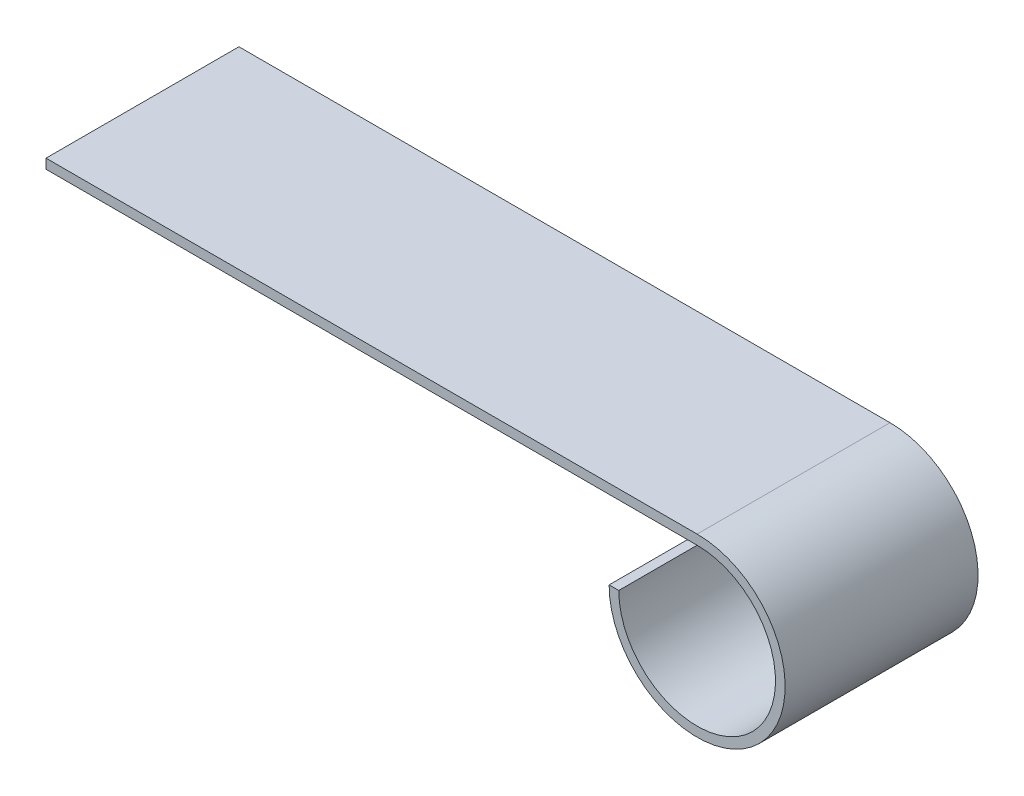
ISO-10303-21;
HEADER;
FILE_DESCRIPTION(('STEP AP214'),'2;1');
FILE_NAME('part.step','',(''),(''),'','','');
FILE_SCHEMA(('AUTOMOTIVE_DESIGN { 1 0 10303 214 1 1 1 1 }'));
ENDSEC;
DATA;
#1=APPLICATION_CONTEXT('core data for automotive mechanical design processes');
#2=APPLICATION_PROTOCOL_DEFINITION('international standard','automotive_design',2000,#1);
#3=PRODUCT_CONTEXT('',#1,'mechanical');
#4=PRODUCT('Part','Part','',(#3));
#5=PRODUCT_RELATED_PRODUCT_CATEGORY('part','',(#4));
#6=PRODUCT_DEFINITION_FORMATION('','',#4);
#7=PRODUCT_DEFINITION_CONTEXT('part definition',#1,'design');
#8=PRODUCT_DEFINITION('design','',#6,#7);
#9=PRODUCT_DEFINITION_SHAPE('','',#8);
#10=(LENGTH_UNIT() NAMED_UNIT(*) SI_UNIT(.MILLI.,.METRE.));
#11=(NAMED_UNIT(*) PLANE_ANGLE_UNIT() SI_UNIT($,.RADIAN.));
#12=(NAMED_UNIT(*) SI_UNIT($,.STERADIAN.) SOLID_ANGLE_UNIT());
#13=UNCERTAINTY_MEASURE_WITH_UNIT(LENGTH_MEASURE(1.E-05),#10,'distance_accuracy_value','');
#14=(GEOMETRIC_REPRESENTATION_CONTEXT(3) GLOBAL_UNCERTAINTY_ASSIGNED_CONTEXT((#13)) GLOBAL_UNIT_ASSIGNED_CONTEXT((#10,
#11,#12)) REPRESENTATION_CONTEXT('',''));
#15=CARTESIAN_POINT('',(0.,0.,0.));
#16=DIRECTION('',(0.,0.,1.));
#17=DIRECTION('',(1.,0.,0.));
#18=AXIS2_PLACEMENT_3D('',#15,#16,#17);
#19=CARTESIAN_POINT('',(33.9080828748774,-0.824677327373322,4.));
#20=DIRECTION('',(0.,0.,-1.));
#21=DIRECTION('',(-1.,0.,0.));
#22=AXIS2_PLACEMENT_3D('',#19,#20,#21);
#23=CYLINDRICAL_SURFACE('',#22,1.82467732737332);
#24=CARTESIAN_POINT('',(33.9080828748774,-0.824677327373322,0.));
#25=DIRECTION('',(0.,0.,1.));
#26=DIRECTION('',(1.,0.,0.));
#27=AXIS2_PLACEMENT_3D('',#24,#25,#26);
#28=CIRCLE('',#27,1.82467732737332);
#29=CARTESIAN_POINT('',(32.0834055475041,-0.824677327373322,0.));
#30=VERTEX_POINT('',#29);
#31=CARTESIAN_POINT('',(33.9080828748774,1.,0.));
#32=VERTEX_POINT('',#31);
#33=EDGE_CURVE('E116',#30,#32,#28,.T.);
#34=ORIENTED_EDGE('',*,*,#33,.T.);
#35=DIRECTION('',(0.,0.,-1.));
#36=VECTOR('',#35,1.);
#37=CARTESIAN_POINT('',(33.9080828748774,1.,4.));
#38=LINE('',#37,#36);
#39=CARTESIAN_POINT('',(33.9080828748774,1.,4.));
#40=VERTEX_POINT('',#39);
#41=EDGE_CURVE('E11',#40,#32,#38,.T.);
#42=ORIENTED_EDGE('',*,*,#41,.F.);
#43=CARTESIAN_POINT('',(33.9080828748774,-0.824677327373322,4.));
#44=DIRECTION('',(0.,0.,1.));
#45=DIRECTION('',(1.,0.,0.));
#46=AXIS2_PLACEMENT_3D('',#43,#44,#45);
#47=CIRCLE('',#46,1.82467732737332);
#48=CARTESIAN_POINT('',(32.0834055475041,-0.824677327373322,4.));
#49=VERTEX_POINT('',#48);
#50=EDGE_CURVE('E127',#49,#40,#47,.T.);
#51=ORIENTED_EDGE('',*,*,#50,.F.);
#52=DIRECTION('',(0.,0.,-1.));
#53=VECTOR('',#52,1.);
#54=CARTESIAN_POINT('',(32.0834055475041,-0.824677327373322,4.));
#55=LINE('',#54,#53);
#56=EDGE_CURVE('E112',#49,#30,#55,.T.);
#57=ORIENTED_EDGE('',*,*,#56,.T.);
#58=EDGE_LOOP('',(#34,#42,#51,#57));
#59=FACE_BOUND('',#58,.T.);
#60=ADVANCED_FACE('F33',(#59),#23,.T.);
#61=CARTESIAN_POINT('',(20.4080828748774,1.,4.));
#62=DIRECTION('',(0.,-1.,0.));
#63=DIRECTION('',(0.,0.,-1.));
#64=AXIS2_PLACEMENT_3D('',#61,#62,#63);
#65=PLANE('',#64);
#66=DIRECTION('',(-1.,0.,0.));
#67=VECTOR('',#66,1.);
#68=CARTESIAN_POINT('',(20.4080828748774,1.,0.));
#69=LINE('',#68,#67);
#70=CARTESIAN_POINT('',(20.4080828748774,1.,0.));
#71=VERTEX_POINT('',#70);
#72=EDGE_CURVE('E119',#32,#71,#69,.T.);
#73=ORIENTED_EDGE('',*,*,#72,.T.);
#74=DIRECTION('',(0.,0.,-1.));
#75=VECTOR('',#74,1.);
#76=CARTESIAN_POINT('',(20.4080828748774,1.,4.));
#77=LINE('',#76,#75);
#78=CARTESIAN_POINT('',(20.4080828748774,1.,4.));
#79=VERTEX_POINT('',#78);
#80=EDGE_CURVE('E41',#79,#71,#77,.T.);
#81=ORIENTED_EDGE('',*,*,#80,.F.);
#82=DIRECTION('',(-1.,0.,0.));
#83=VECTOR('',#82,1.);
#84=CARTESIAN_POINT('',(20.4080828748774,1.,4.));
#85=LINE('',#84,#83);
#86=EDGE_CURVE('E86',#40,#79,#85,.T.);
#87=ORIENTED_EDGE('',*,*,#86,.F.);
#88=ORIENTED_EDGE('',*,*,#41,.T.);
#89=EDGE_LOOP('',(#73,#81,#87,#88));
#90=FACE_BOUND('',#89,.T.);
#91=ADVANCED_FACE('F151',(#90),#65,.F.);
#92=CARTESIAN_POINT('',(20.4080828748774,1.,4.));
#93=DIRECTION('',(1.,0.,0.));
#94=DIRECTION('',(0.,0.,-1.));
#95=AXIS2_PLACEMENT_3D('',#92,#93,#94);
#96=PLANE('',#95);
#97=DIRECTION('',(0.,-1.,0.));
#98=VECTOR('',#97,1.);
#99=CARTESIAN_POINT('',(20.4080828748774,1.,0.));
#100=LINE('',#99,#98);
#101=CARTESIAN_POINT('',(20.4080828748774,0.8,0.));
#102=VERTEX_POINT('',#101);
#103=EDGE_CURVE('E121',#71,#102,#100,.T.);
#104=ORIENTED_EDGE('',*,*,#103,.T.);
#105=DIRECTION('',(0.,0.,-1.));
#106=VECTOR('',#105,1.);
#107=CARTESIAN_POINT('',(20.4080828748774,0.8,4.));
#108=LINE('',#107,#106);
#109=CARTESIAN_POINT('',(20.4080828748774,0.8,4.));
#110=VERTEX_POINT('',#109);
#111=EDGE_CURVE('E107',#110,#102,#108,.T.);
#112=ORIENTED_EDGE('',*,*,#111,.F.);
#113=DIRECTION('',(0.,-1.,0.));
#114=VECTOR('',#113,1.);
#115=CARTESIAN_POINT('',(20.4080828748774,1.,4.));
#116=LINE('',#115,#114);
#117=EDGE_CURVE('E99',#79,#110,#116,.T.);
#118=ORIENTED_EDGE('',*,*,#117,.F.);
#119=ORIENTED_EDGE('',*,*,#80,.T.);
#120=EDGE_LOOP('',(#104,#112,#118,#119));
#121=FACE_BOUND('',#120,.T.);
#122=ADVANCED_FACE('F133',(#121),#96,.F.);
#123=CARTESIAN_POINT('',(33.077498182658,0.8,4.));
#124=DIRECTION('',(0.,1.,0.));
#125=DIRECTION('',(-1.,0.,0.));
#126=AXIS2_PLACEMENT_3D('',#123,#124,#125);
#127=PLANE('',#126);
#128=DIRECTION('',(1.,0.,0.));
#129=VECTOR('',#128,1.);
#130=CARTESIAN_POINT('',(33.077498182658,0.8,0.));
#131=LINE('',#130,#129);
#132=CARTESIAN_POINT('',(33.9080828748774,0.799999999999998,0.));
#133=VERTEX_POINT('',#132);
#134=EDGE_CURVE('E106',#102,#133,#131,.T.);
#135=ORIENTED_EDGE('',*,*,#134,.T.);
#136=DIRECTION('',(0.,0.,-1.));
#137=VECTOR('',#136,1.);
#138=CARTESIAN_POINT('',(33.9080828748774,0.799999999999998,4.));
#139=LINE('',#138,#137);
#140=CARTESIAN_POINT('',(33.9080828748774,0.799999999999998,4.));
#141=VERTEX_POINT('',#140);
#142=EDGE_CURVE('E104',#141,#133,#139,.T.);
#143=ORIENTED_EDGE('',*,*,#142,.F.);
#144=DIRECTION('',(1.,0.,0.));
#145=VECTOR('',#144,1.);
#146=CARTESIAN_POINT('',(20.4080828748774,0.8,4.));
#147=LINE('',#146,#145);
#148=EDGE_CURVE('E93',#110,#141,#147,.T.);
#149=ORIENTED_EDGE('',*,*,#148,.F.);
#150=ORIENTED_EDGE('',*,*,#111,.T.);
#151=EDGE_LOOP('',(#135,#143,#149,#150));
#152=FACE_BOUND('',#151,.T.);
#153=ADVANCED_FACE('F105',(#152),#127,.F.);
#154=CARTESIAN_POINT('',(33.9080828748774,-0.824677327373322,4.));
#155=DIRECTION('',(0.,0.,-1.));
#156=DIRECTION('',(-1.,0.,0.));
#157=AXIS2_PLACEMENT_3D('',#154,#155,#156);
#158=CYLINDRICAL_SURFACE('',#157,1.62467732737332);
#159=CARTESIAN_POINT('',(33.9080828748774,-0.824677327373322,0.));
#160=DIRECTION('',(0.,0.,-1.));
#161=DIRECTION('',(1.,0.,0.));
#162=AXIS2_PLACEMENT_3D('',#159,#160,#161);
#163=CIRCLE('',#162,1.62467732737332);
#164=CARTESIAN_POINT('',(32.2834055475041,-0.824677327373322,0.));
#165=VERTEX_POINT('',#164);
#166=EDGE_CURVE('E72',#133,#165,#163,.T.);
#167=ORIENTED_EDGE('',*,*,#166,.T.);
#168=DIRECTION('',(0.,0.,-1.));
#169=VECTOR('',#168,1.);
#170=CARTESIAN_POINT('',(32.2834055475041,-0.824677327373322,4.));
#171=LINE('',#170,#169);
#172=CARTESIAN_POINT('',(32.2834055475041,-0.824677327373322,4.));
#173=VERTEX_POINT('',#172);
#174=EDGE_CURVE('E108',#173,#165,#171,.T.);
#175=ORIENTED_EDGE('',*,*,#174,.F.);
#176=CARTESIAN_POINT('',(33.9080828748774,-0.824677327373322,4.));
#177=DIRECTION('',(0.,0.,-1.));
#178=DIRECTION('',(1.,0.,0.));
#179=AXIS2_PLACEMENT_3D('',#176,#177,#178);
#180=CIRCLE('',#179,1.62467732737332);
#181=EDGE_CURVE('E97',#141,#173,#180,.T.);
#182=ORIENTED_EDGE('',*,*,#181,.F.);
#183=ORIENTED_EDGE('',*,*,#142,.T.);
#184=EDGE_LOOP('',(#167,#175,#182,#183));
#185=FACE_BOUND('',#184,.T.);
#186=ADVANCED_FACE('F110',(#185),#158,.F.);
#187=CARTESIAN_POINT('',(32.2834055475041,-0.824677327373322,4.));
#188=DIRECTION('',(0.,-1.,0.));
#189=DIRECTION('',(0.,0.,-1.));
#190=AXIS2_PLACEMENT_3D('',#187,#188,#189);
#191=PLANE('',#190);
#192=DIRECTION('',(-1.,0.,0.));
#193=VECTOR('',#192,1.);
#194=CARTESIAN_POINT('',(32.2834055475041,-0.824677327373322,0.));
#195=LINE('',#194,#193);
#196=EDGE_CURVE('E78',#165,#30,#195,.T.);
#197=ORIENTED_EDGE('',*,*,#196,.T.);
#198=ORIENTED_EDGE('',*,*,#56,.F.);
#199=DIRECTION('',(-1.,0.,0.));
#200=VECTOR('',#199,1.);
#201=CARTESIAN_POINT('',(32.2834055475041,-0.824677327373322,4.));
#202=LINE('',#201,#200);
#203=EDGE_CURVE('E49',#173,#49,#202,.T.);
#204=ORIENTED_EDGE('',*,*,#203,.F.);
#205=ORIENTED_EDGE('',*,*,#174,.T.);
#206=EDGE_LOOP('',(#197,#198,#204,#205));
#207=FACE_BOUND('',#206,.T.);
#208=ADVANCED_FACE('F140',(#207),#191,.F.);
#209=CARTESIAN_POINT('',(33.9080828748774,-0.824677327373322,4.));
#210=DIRECTION('',(0.,0.,1.));
#211=DIRECTION('',(1.,0.,0.));
#212=AXIS2_PLACEMENT_3D('',#209,#210,#211);
#213=PLANE('',#212);
#214=ORIENTED_EDGE('',*,*,#50,.T.);
#215=ORIENTED_EDGE('',*,*,#86,.T.);
#216=ORIENTED_EDGE('',*,*,#117,.T.);
#217=ORIENTED_EDGE('',*,*,#148,.T.);
#218=ORIENTED_EDGE('',*,*,#181,.T.);
#219=ORIENTED_EDGE('',*,*,#203,.T.);
#220=EDGE_LOOP('',(#214,#215,#216,#217,#218,#219));
#221=FACE_BOUND('',#220,.T.);
#222=ADVANCED_FACE('F95',(#221),#213,.T.);
#223=CARTESIAN_POINT('',(33.9080828748774,-0.824677327373322,0.));
#224=DIRECTION('',(0.,0.,1.));
#225=DIRECTION('',(1.,0.,0.));
#226=AXIS2_PLACEMENT_3D('',#223,#224,#225);
#227=PLANE('',#226);
#228=ORIENTED_EDGE('',*,*,#33,.F.);
#229=ORIENTED_EDGE('',*,*,#196,.F.);
#230=ORIENTED_EDGE('',*,*,#166,.F.);
#231=ORIENTED_EDGE('',*,*,#134,.F.);
#232=ORIENTED_EDGE('',*,*,#103,.F.);
#233=ORIENTED_EDGE('',*,*,#72,.F.);
#234=EDGE_LOOP('',(#228,#229,#230,#231,#232,#233));
#235=FACE_BOUND('',#234,.T.);
#236=ADVANCED_FACE('F136',(#235),#227,.F.);
#237=CLOSED_SHELL('',(#60,#91,#122,#153,#186,#208,#222,#236));
#238=MANIFOLD_SOLID_BREP('B2',#237);
#239=ADVANCED_BREP_SHAPE_REPRESENTATION('',(#18,#238),#14);
#240=SHAPE_DEFINITION_REPRESENTATION(#9,#239);
ENDSEC;
END-ISO-10303-21;
